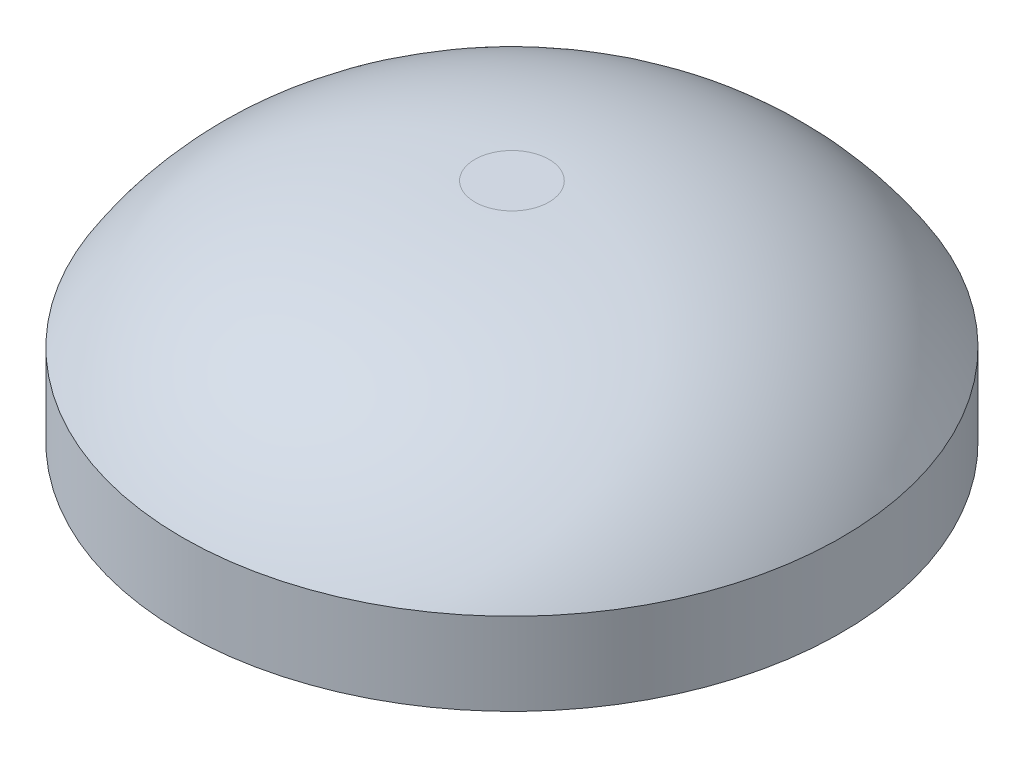
ISO-10303-21;
HEADER;
FILE_DESCRIPTION(('STEP AP214'),'2;1');
FILE_NAME('part.step','',(''),(''),'','','');
FILE_SCHEMA(('AUTOMOTIVE_DESIGN { 1 0 10303 214 1 1 1 1 }'));
ENDSEC;
DATA;
#1=APPLICATION_CONTEXT('core data for automotive mechanical design processes');
#2=APPLICATION_PROTOCOL_DEFINITION('international standard','automotive_design',2000,#1);
#3=PRODUCT_CONTEXT('',#1,'mechanical');
#4=PRODUCT('Part','Part','',(#3));
#5=PRODUCT_RELATED_PRODUCT_CATEGORY('part','',(#4));
#6=PRODUCT_DEFINITION_FORMATION('','',#4);
#7=PRODUCT_DEFINITION_CONTEXT('part definition',#1,'design');
#8=PRODUCT_DEFINITION('design','',#6,#7);
#9=PRODUCT_DEFINITION_SHAPE('','',#8);
#10=(LENGTH_UNIT() NAMED_UNIT(*) SI_UNIT(.MILLI.,.METRE.));
#11=(NAMED_UNIT(*) PLANE_ANGLE_UNIT() SI_UNIT($,.RADIAN.));
#12=(NAMED_UNIT(*) SI_UNIT($,.STERADIAN.) SOLID_ANGLE_UNIT());
#13=UNCERTAINTY_MEASURE_WITH_UNIT(LENGTH_MEASURE(1.E-05),#10,'distance_accuracy_value','');
#14=(GEOMETRIC_REPRESENTATION_CONTEXT(3) GLOBAL_UNCERTAINTY_ASSIGNED_CONTEXT((#13)) GLOBAL_UNIT_ASSIGNED_CONTEXT((#10,
#11,#12)) REPRESENTATION_CONTEXT('',''));
#15=CARTESIAN_POINT('',(0.,0.,0.));
#16=DIRECTION('',(0.,0.,1.));
#17=DIRECTION('',(1.,0.,0.));
#18=AXIS2_PLACEMENT_3D('',#15,#16,#17);
#19=CARTESIAN_POINT('',(0.,2.75,0.));
#20=CARTESIAN_POINT('',(3.04796113419103,2.83211970914733,0.));
#21=CARTESIAN_POINT('',(4.14911481381274,0.740921126495694,0.));
#22=B_SPLINE_CURVE_WITH_KNOTS('',2,(#19,#20,#21),.UNSPECIFIED.,.F.,.F.,(3,3),(0.,1.),.UNSPECIFIED.);
#23=CARTESIAN_POINT('',(0.,2.75,0.));
#24=DIRECTION('',(0.,1.,0.));
#25=AXIS1_PLACEMENT('',#23,#24);
#26=SURFACE_OF_REVOLUTION('',#22,#25);
#27=CARTESIAN_POINT('',(0.,1.,0.));
#28=DIRECTION('',(0.,1.,0.));
#29=DIRECTION('',(0.,0.,1.));
#30=AXIS2_PLACEMENT_3D('',#27,#28,#29);
#31=CIRCLE('',#30,4.);
#32=CARTESIAN_POINT('',(0.,1.,4.));
#33=VERTEX_POINT('',#32);
#34=EDGE_CURVE('E44',#33,#33,#31,.T.);
#35=ORIENTED_EDGE('',*,*,#34,.T.);
#36=EDGE_LOOP('',(#35));
#37=FACE_BOUND('',#36,.T.);
#38=CARTESIAN_POINT('',(0.,2.75,0.));
#39=DIRECTION('',(0.,1.,0.));
#40=DIRECTION('',(0.,0.,1.));
#41=AXIS2_PLACEMENT_3D('',#38,#39,#40);
#42=CIRCLE('',#41,0.449555654268723);
#43=CARTESIAN_POINT('',(0.,2.75,0.449555654268723));
#44=VERTEX_POINT('',#43);
#45=EDGE_CURVE('E10',#44,#44,#42,.T.);
#46=ORIENTED_EDGE('',*,*,#45,.F.);
#47=EDGE_LOOP('',(#46));
#48=FACE_BOUND('',#47,.T.);
#49=ADVANCED_FACE('F33',(#37,#48),#26,.F.);
#50=CARTESIAN_POINT('',(0.,2.75,0.));
#51=DIRECTION('',(0.,1.,0.));
#52=DIRECTION('',(0.,0.,1.));
#53=AXIS2_PLACEMENT_3D('',#50,#51,#52);
#54=PLANE('',#53);
#55=ORIENTED_EDGE('',*,*,#45,.T.);
#56=EDGE_LOOP('',(#55));
#57=FACE_BOUND('',#56,.T.);
#58=ADVANCED_FACE('F66',(#57),#54,.T.);
#59=CARTESIAN_POINT('',(0.,0.,0.));
#60=DIRECTION('',(0.,1.,0.));
#61=DIRECTION('',(0.,0.,1.));
#62=AXIS2_PLACEMENT_3D('',#59,#60,#61);
#63=PLANE('',#62);
#64=CARTESIAN_POINT('',(0.,0.,0.));
#65=DIRECTION('',(0.,1.,0.));
#66=DIRECTION('',(0.,0.,1.));
#67=AXIS2_PLACEMENT_3D('',#64,#65,#66);
#68=CIRCLE('',#67,4.);
#69=CARTESIAN_POINT('',(0.,0.,4.));
#70=VERTEX_POINT('',#69);
#71=EDGE_CURVE('E40',#70,#70,#68,.T.);
#72=ORIENTED_EDGE('',*,*,#71,.F.);
#73=EDGE_LOOP('',(#72));
#74=FACE_BOUND('',#73,.T.);
#75=ADVANCED_FACE('F61',(#74),#63,.F.);
#76=CARTESIAN_POINT('',(0.,2.75,0.));
#77=DIRECTION('',(0.,1.,0.));
#78=DIRECTION('',(0.,0.,1.));
#79=AXIS2_PLACEMENT_3D('',#76,#77,#78);
#80=CYLINDRICAL_SURFACE('',#79,4.);
#81=ORIENTED_EDGE('',*,*,#34,.F.);
#82=EDGE_LOOP('',(#81));
#83=FACE_BOUND('',#82,.T.);
#84=ORIENTED_EDGE('',*,*,#71,.T.);
#85=EDGE_LOOP('',(#84));
#86=FACE_BOUND('',#85,.T.);
#87=ADVANCED_FACE('F59',(#83,#86),#80,.T.);
#88=CLOSED_SHELL('',(#49,#58,#75,#87));
#89=MANIFOLD_SOLID_BREP('B2',#88);
#90=ADVANCED_BREP_SHAPE_REPRESENTATION('',(#18,#89),#14);
#91=SHAPE_DEFINITION_REPRESENTATION(#9,#90);
ENDSEC;
END-ISO-10303-21;
